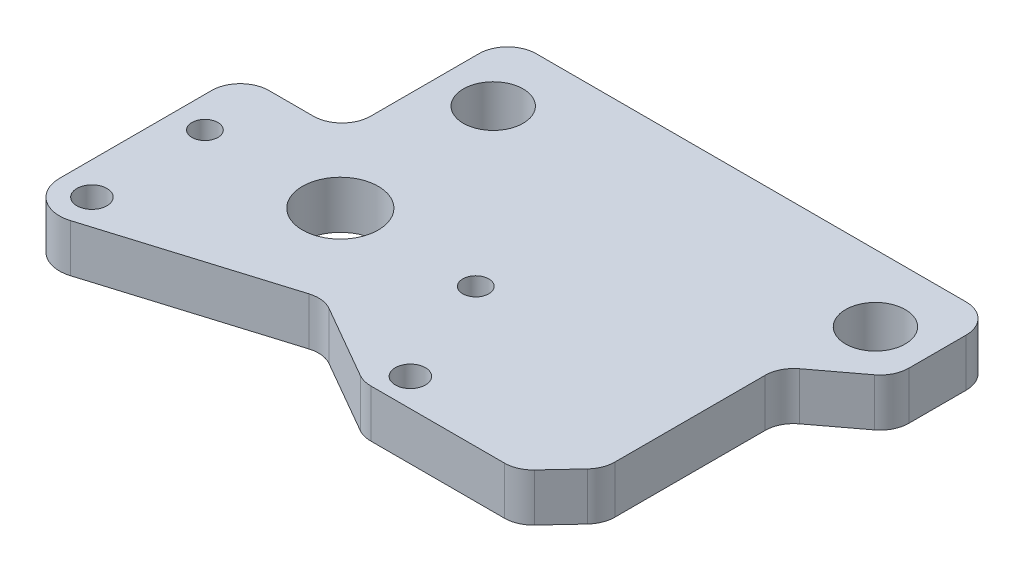
ISO-10303-21;
HEADER;
FILE_DESCRIPTION(('STEP AP214'),'2;1');
FILE_NAME('part.step','',(''),(''),'','','');
FILE_SCHEMA(('AUTOMOTIVE_DESIGN { 1 0 10303 214 1 1 1 1 }'));
ENDSEC;
DATA;
#1=APPLICATION_CONTEXT('core data for automotive mechanical design processes');
#2=APPLICATION_PROTOCOL_DEFINITION('international standard','automotive_design',2000,#1);
#3=PRODUCT_CONTEXT('',#1,'mechanical');
#4=PRODUCT('Part','Part','',(#3));
#5=PRODUCT_RELATED_PRODUCT_CATEGORY('part','',(#4));
#6=PRODUCT_DEFINITION_FORMATION('','',#4);
#7=PRODUCT_DEFINITION_CONTEXT('part definition',#1,'design');
#8=PRODUCT_DEFINITION('design','',#6,#7);
#9=PRODUCT_DEFINITION_SHAPE('','',#8);
#10=(LENGTH_UNIT() NAMED_UNIT(*) SI_UNIT(.MILLI.,.METRE.));
#11=(NAMED_UNIT(*) PLANE_ANGLE_UNIT() SI_UNIT($,.RADIAN.));
#12=(NAMED_UNIT(*) SI_UNIT($,.STERADIAN.) SOLID_ANGLE_UNIT());
#13=UNCERTAINTY_MEASURE_WITH_UNIT(LENGTH_MEASURE(1.E-05),#10,'distance_accuracy_value','');
#14=(GEOMETRIC_REPRESENTATION_CONTEXT(3) GLOBAL_UNCERTAINTY_ASSIGNED_CONTEXT((#13)) GLOBAL_UNIT_ASSIGNED_CONTEXT((#10,
#11,#12)) REPRESENTATION_CONTEXT('',''));
#15=CARTESIAN_POINT('',(0.,0.,0.));
#16=DIRECTION('',(0.,0.,1.));
#17=DIRECTION('',(1.,0.,0.));
#18=AXIS2_PLACEMENT_3D('',#15,#16,#17);
#19=CARTESIAN_POINT('',(4.00320661854568,-6.35,13.0969768672636));
#20=DIRECTION('',(-0.29230886403007,0.,-0.95632396603319));
#21=DIRECTION('',(-0.95632396603319,0.,0.29230886403007));
#22=AXIS2_PLACEMENT_3D('',#19,#20,#21);
#23=PLANE('',#22);
#24=DIRECTION('',(-0.95632396603319,0.,0.29230886403007));
#25=VECTOR('',#24,1.);
#26=CARTESIAN_POINT('',(4.00320661854568,0.,13.0969768672636));
#27=LINE('',#26,#25);
#28=CARTESIAN_POINT('',(7.76555921931062,0.,11.9469805753459));
#29=VERTEX_POINT('',#28);
#30=CARTESIAN_POINT('',(-16.5178103251182,0.,19.3694068853313));
#31=VERTEX_POINT('',#30);
#32=EDGE_CURVE('E258',#29,#31,#27,.T.);
#33=ORIENTED_EDGE('',*,*,#32,.T.);
#34=DIRECTION('',(0.,1.,0.));
#35=VECTOR('',#34,1.);
#36=CARTESIAN_POINT('',(-16.5178103251182,-6.35,19.3694068853313));
#37=LINE('',#36,#35);
#38=CARTESIAN_POINT('',(-16.5178103251182,-6.35,19.3694068853313));
#39=VERTEX_POINT('',#38);
#40=EDGE_CURVE('E11',#39,#31,#37,.T.);
#41=ORIENTED_EDGE('',*,*,#40,.F.);
#42=DIRECTION('',(-0.95632396603319,0.,0.29230886403007));
#43=VECTOR('',#42,1.);
#44=CARTESIAN_POINT('',(4.00320661854568,-6.35,13.0969768672636));
#45=LINE('',#44,#43);
#46=CARTESIAN_POINT('',(7.76555921931062,-6.35,11.9469805753459));
#47=VERTEX_POINT('',#46);
#48=EDGE_CURVE('E399',#47,#39,#45,.T.);
#49=ORIENTED_EDGE('',*,*,#48,.F.);
#50=DIRECTION('',(0.,1.,0.));
#51=VECTOR('',#50,1.);
#52=CARTESIAN_POINT('',(7.76555921931062,-6.35,11.9469805753459));
#53=LINE('',#52,#51);
#54=EDGE_CURVE('E47',#47,#29,#53,.T.);
#55=ORIENTED_EDGE('',*,*,#54,.T.);
#56=EDGE_LOOP('',(#33,#41,#49,#55));
#57=FACE_BOUND('',#56,.T.);
#58=ADVANCED_FACE('F43',(#57),#23,.F.);
#59=CARTESIAN_POINT('',(-17.78,-6.35,15.24));
#60=DIRECTION('',(0.,1.,0.));
#61=DIRECTION('',(0.,0.,1.));
#62=AXIS2_PLACEMENT_3D('',#59,#60,#61);
#63=CYLINDRICAL_SURFACE('',#62,4.318);
#64=CARTESIAN_POINT('',(-17.78,0.,15.24));
#65=DIRECTION('',(0.,1.,0.));
#66=DIRECTION('',(0.,0.,1.));
#67=AXIS2_PLACEMENT_3D('',#64,#65,#66);
#68=CIRCLE('',#67,4.318);
#69=CARTESIAN_POINT('',(-22.098,0.,15.24));
#70=VERTEX_POINT('',#69);
#71=EDGE_CURVE('E130',#31,#70,#68,.F.);
#72=ORIENTED_EDGE('',*,*,#71,.T.);
#73=DIRECTION('',(0.,1.,0.));
#74=VECTOR('',#73,1.);
#75=CARTESIAN_POINT('',(-22.098,-6.35,15.24));
#76=LINE('',#75,#74);
#77=CARTESIAN_POINT('',(-22.098,-6.35,15.24));
#78=VERTEX_POINT('',#77);
#79=EDGE_CURVE('E54',#78,#70,#76,.T.);
#80=ORIENTED_EDGE('',*,*,#79,.F.);
#81=CARTESIAN_POINT('',(-17.78,-6.35,15.24));
#82=DIRECTION('',(0.,1.,0.));
#83=DIRECTION('',(0.,0.,1.));
#84=AXIS2_PLACEMENT_3D('',#81,#82,#83);
#85=CIRCLE('',#84,4.318);
#86=EDGE_CURVE('E62',#39,#78,#85,.F.);
#87=ORIENTED_EDGE('',*,*,#86,.F.);
#88=ORIENTED_EDGE('',*,*,#40,.T.);
#89=EDGE_LOOP('',(#72,#80,#87,#88));
#90=FACE_BOUND('',#89,.T.);
#91=ADVANCED_FACE('F417',(#90),#63,.T.);
#92=CARTESIAN_POINT('',(-22.098,-6.35,0.));
#93=DIRECTION('',(1.,0.,0.));
#94=DIRECTION('',(0.,0.,-1.));
#95=AXIS2_PLACEMENT_3D('',#92,#93,#94);
#96=PLANE('',#95);
#97=DIRECTION('',(0.,0.,-1.));
#98=VECTOR('',#97,1.);
#99=CARTESIAN_POINT('',(-22.098,0.,0.));
#100=LINE('',#99,#98);
#101=CARTESIAN_POINT('',(-22.098,0.,-4.98750012199999));
#102=VERTEX_POINT('',#101);
#103=EDGE_CURVE('E211',#70,#102,#100,.T.);
#104=ORIENTED_EDGE('',*,*,#103,.T.);
#105=DIRECTION('',(0.,1.,0.));
#106=VECTOR('',#105,1.);
#107=CARTESIAN_POINT('',(-22.098,-6.35,-4.98750012199999));
#108=LINE('',#107,#106);
#109=CARTESIAN_POINT('',(-22.098,-6.35,-4.98750012199999));
#110=VERTEX_POINT('',#109);
#111=EDGE_CURVE('E209',#110,#102,#108,.T.);
#112=ORIENTED_EDGE('',*,*,#111,.F.);
#113=DIRECTION('',(0.,0.,-1.));
#114=VECTOR('',#113,1.);
#115=CARTESIAN_POINT('',(-22.098,-6.35,0.));
#116=LINE('',#115,#114);
#117=EDGE_CURVE('E199',#78,#110,#116,.T.);
#118=ORIENTED_EDGE('',*,*,#117,.F.);
#119=ORIENTED_EDGE('',*,*,#79,.T.);
#120=EDGE_LOOP('',(#104,#112,#118,#119));
#121=FACE_BOUND('',#120,.T.);
#122=ADVANCED_FACE('F210',(#121),#96,.F.);
#123=CARTESIAN_POINT('',(-18.288,-6.35,-4.98750012199999));
#124=DIRECTION('',(0.,1.,0.));
#125=DIRECTION('',(0.,0.,1.));
#126=AXIS2_PLACEMENT_3D('',#123,#124,#125);
#127=CYLINDRICAL_SURFACE('',#126,3.81);
#128=CARTESIAN_POINT('',(-18.288,0.,-4.98750012199999));
#129=DIRECTION('',(0.,1.,0.));
#130=DIRECTION('',(0.,0.,1.));
#131=AXIS2_PLACEMENT_3D('',#128,#129,#130);
#132=CIRCLE('',#131,3.81);
#133=CARTESIAN_POINT('',(-18.288,0.,-8.797500122));
#134=VERTEX_POINT('',#133);
#135=EDGE_CURVE('E327',#102,#134,#132,.F.);
#136=ORIENTED_EDGE('',*,*,#135,.T.);
#137=DIRECTION('',(0.,1.,0.));
#138=VECTOR('',#137,1.);
#139=CARTESIAN_POINT('',(-18.288,-6.35,-8.797500122));
#140=LINE('',#139,#138);
#141=CARTESIAN_POINT('',(-18.288,-6.35,-8.797500122));
#142=VERTEX_POINT('',#141);
#143=EDGE_CURVE('E215',#142,#134,#140,.T.);
#144=ORIENTED_EDGE('',*,*,#143,.F.);
#145=CARTESIAN_POINT('',(-18.288,-6.35,-4.98750012199999));
#146=DIRECTION('',(0.,1.,0.));
#147=DIRECTION('',(0.,0.,1.));
#148=AXIS2_PLACEMENT_3D('',#145,#146,#147);
#149=CIRCLE('',#148,3.81);
#150=EDGE_CURVE('E203',#110,#142,#149,.F.);
#151=ORIENTED_EDGE('',*,*,#150,.F.);
#152=ORIENTED_EDGE('',*,*,#111,.T.);
#153=EDGE_LOOP('',(#136,#144,#151,#152));
#154=FACE_BOUND('',#153,.T.);
#155=ADVANCED_FACE('F217',(#154),#127,.T.);
#156=CARTESIAN_POINT('',(0.,-6.35,-8.797500122));
#157=DIRECTION('',(0.,0.,1.));
#158=DIRECTION('',(1.,0.,0.));
#159=AXIS2_PLACEMENT_3D('',#156,#157,#158);
#160=PLANE('',#159);
#161=DIRECTION('',(1.,0.,0.));
#162=VECTOR('',#161,1.);
#163=CARTESIAN_POINT('',(0.,0.,-8.797500122));
#164=LINE('',#163,#162);
#165=CARTESIAN_POINT('',(-12.3825,0.,-8.797500122));
#166=VERTEX_POINT('',#165);
#167=EDGE_CURVE('E324',#134,#166,#164,.T.);
#168=ORIENTED_EDGE('',*,*,#167,.T.);
#169=DIRECTION('',(0.,1.,0.));
#170=VECTOR('',#169,1.);
#171=CARTESIAN_POINT('',(-12.3825,-6.35,-8.797500122));
#172=LINE('',#171,#170);
#173=CARTESIAN_POINT('',(-12.3825,-6.35,-8.797500122));
#174=VERTEX_POINT('',#173);
#175=EDGE_CURVE('E339',#174,#166,#172,.T.);
#176=ORIENTED_EDGE('',*,*,#175,.F.);
#177=DIRECTION('',(1.,0.,0.));
#178=VECTOR('',#177,1.);
#179=CARTESIAN_POINT('',(0.,-6.35,-8.797500122));
#180=LINE('',#179,#178);
#181=EDGE_CURVE('E221',#142,#174,#180,.T.);
#182=ORIENTED_EDGE('',*,*,#181,.F.);
#183=ORIENTED_EDGE('',*,*,#143,.T.);
#184=EDGE_LOOP('',(#168,#176,#182,#183));
#185=FACE_BOUND('',#184,.T.);
#186=ADVANCED_FACE('F479',(#185),#160,.F.);
#187=CARTESIAN_POINT('',(-12.3825,-6.35,-12.607500122));
#188=DIRECTION('',(0.,1.,0.));
#189=DIRECTION('',(0.,0.,1.));
#190=AXIS2_PLACEMENT_3D('',#187,#188,#189);
#191=CYLINDRICAL_SURFACE('',#190,3.81);
#192=CARTESIAN_POINT('',(-12.3825,0.,-12.607500122));
#193=DIRECTION('',(0.,1.,0.));
#194=DIRECTION('',(0.,0.,1.));
#195=AXIS2_PLACEMENT_3D('',#192,#193,#194);
#196=CIRCLE('',#195,3.81);
#197=CARTESIAN_POINT('',(-8.57250000000001,0.,-12.607500122));
#198=VERTEX_POINT('',#197);
#199=EDGE_CURVE('E320',#166,#198,#196,.T.);
#200=ORIENTED_EDGE('',*,*,#199,.T.);
#201=DIRECTION('',(0.,1.,0.));
#202=VECTOR('',#201,1.);
#203=CARTESIAN_POINT('',(-8.57250000000001,-6.35,-12.607500122));
#204=LINE('',#203,#202);
#205=CARTESIAN_POINT('',(-8.57250000000001,-6.35,-12.607500122));
#206=VERTEX_POINT('',#205);
#207=EDGE_CURVE('E343',#206,#198,#204,.T.);
#208=ORIENTED_EDGE('',*,*,#207,.F.);
#209=CARTESIAN_POINT('',(-12.3825,-6.35,-12.607500122));
#210=DIRECTION('',(0.,1.,0.));
#211=DIRECTION('',(0.,0.,1.));
#212=AXIS2_PLACEMENT_3D('',#209,#210,#211);
#213=CIRCLE('',#212,3.81);
#214=EDGE_CURVE('E224',#174,#206,#213,.T.);
#215=ORIENTED_EDGE('',*,*,#214,.F.);
#216=ORIENTED_EDGE('',*,*,#175,.T.);
#217=EDGE_LOOP('',(#200,#208,#215,#216));
#218=FACE_BOUND('',#217,.T.);
#219=ADVANCED_FACE('F482',(#218),#191,.F.);
#220=CARTESIAN_POINT('',(-8.57250000000001,-6.35,0.));
#221=DIRECTION('',(-1.,0.,0.));
#222=DIRECTION('',(0.,0.,1.));
#223=AXIS2_PLACEMENT_3D('',#220,#221,#222);
#224=PLANE('',#223);
#225=DIRECTION('',(0.,0.,1.));
#226=VECTOR('',#225,1.);
#227=CARTESIAN_POINT('',(-8.57250000000001,0.,0.));
#228=LINE('',#227,#226);
#229=CARTESIAN_POINT('',(-8.5725,0.,-26.9875));
#230=VERTEX_POINT('',#229);
#231=EDGE_CURVE('E316',#230,#198,#228,.T.);
#232=ORIENTED_EDGE('',*,*,#231,.F.);
#233=DIRECTION('',(0.,1.,0.));
#234=VECTOR('',#233,1.);
#235=CARTESIAN_POINT('',(-8.5725,-6.35,-26.9875));
#236=LINE('',#235,#234);
#237=CARTESIAN_POINT('',(-8.5725,-6.35,-26.9875));
#238=VERTEX_POINT('',#237);
#239=EDGE_CURVE('E346',#238,#230,#236,.T.);
#240=ORIENTED_EDGE('',*,*,#239,.F.);
#241=DIRECTION('',(0.,0.,1.));
#242=VECTOR('',#241,1.);
#243=CARTESIAN_POINT('',(-8.57250000000001,-6.35,0.));
#244=LINE('',#243,#242);
#245=EDGE_CURVE('E600',#238,#206,#244,.T.);
#246=ORIENTED_EDGE('',*,*,#245,.T.);
#247=ORIENTED_EDGE('',*,*,#207,.T.);
#248=EDGE_LOOP('',(#232,#240,#246,#247));
#249=FACE_BOUND('',#248,.T.);
#250=ADVANCED_FACE('F486',(#249),#224,.T.);
#251=CARTESIAN_POINT('',(-4.7625,-6.35,-26.9875));
#252=DIRECTION('',(0.,1.,0.));
#253=DIRECTION('',(0.,0.,1.));
#254=AXIS2_PLACEMENT_3D('',#251,#252,#253);
#255=CYLINDRICAL_SURFACE('',#254,3.81);
#256=CARTESIAN_POINT('',(-4.7625,0.,-26.9875));
#257=DIRECTION('',(0.,1.,0.));
#258=DIRECTION('',(0.,0.,1.));
#259=AXIS2_PLACEMENT_3D('',#256,#257,#258);
#260=CIRCLE('',#259,3.81);
#261=CARTESIAN_POINT('',(-4.7625,0.,-30.7975));
#262=VERTEX_POINT('',#261);
#263=EDGE_CURVE('E312',#230,#262,#260,.F.);
#264=ORIENTED_EDGE('',*,*,#263,.T.);
#265=DIRECTION('',(0.,1.,0.));
#266=VECTOR('',#265,1.);
#267=CARTESIAN_POINT('',(-4.7625,-6.35,-30.7975));
#268=LINE('',#267,#266);
#269=CARTESIAN_POINT('',(-4.7625,-6.35,-30.7975));
#270=VERTEX_POINT('',#269);
#271=EDGE_CURVE('E349',#270,#262,#268,.T.);
#272=ORIENTED_EDGE('',*,*,#271,.F.);
#273=CARTESIAN_POINT('',(-4.7625,-6.35,-26.9875));
#274=DIRECTION('',(0.,1.,0.));
#275=DIRECTION('',(0.,0.,1.));
#276=AXIS2_PLACEMENT_3D('',#273,#274,#275);
#277=CIRCLE('',#276,3.81);
#278=EDGE_CURVE('E606',#238,#270,#277,.F.);
#279=ORIENTED_EDGE('',*,*,#278,.F.);
#280=ORIENTED_EDGE('',*,*,#239,.T.);
#281=EDGE_LOOP('',(#264,#272,#279,#280));
#282=FACE_BOUND('',#281,.T.);
#283=ADVANCED_FACE('F490',(#282),#255,.T.);
#284=CARTESIAN_POINT('',(0.,-6.35,-30.7975));
#285=DIRECTION('',(0.,0.,-1.));
#286=DIRECTION('',(-1.,0.,0.));
#287=AXIS2_PLACEMENT_3D('',#284,#285,#286);
#288=PLANE('',#287);
#289=DIRECTION('',(-1.,0.,0.));
#290=VECTOR('',#289,1.);
#291=CARTESIAN_POINT('',(0.,0.,-30.7975));
#292=LINE('',#291,#290);
#293=CARTESIAN_POINT('',(52.3875,0.,-30.7975));
#294=VERTEX_POINT('',#293);
#295=EDGE_CURVE('E308',#294,#262,#292,.T.);
#296=ORIENTED_EDGE('',*,*,#295,.F.);
#297=DIRECTION('',(0.,1.,0.));
#298=VECTOR('',#297,1.);
#299=CARTESIAN_POINT('',(52.3875,-6.35,-30.7975));
#300=LINE('',#299,#298);
#301=CARTESIAN_POINT('',(52.3875,-6.35,-30.7975));
#302=VERTEX_POINT('',#301);
#303=EDGE_CURVE('E352',#302,#294,#300,.T.);
#304=ORIENTED_EDGE('',*,*,#303,.F.);
#305=DIRECTION('',(-1.,0.,0.));
#306=VECTOR('',#305,1.);
#307=CARTESIAN_POINT('',(0.,-6.35,-30.7975));
#308=LINE('',#307,#306);
#309=EDGE_CURVE('E593',#302,#270,#308,.T.);
#310=ORIENTED_EDGE('',*,*,#309,.T.);
#311=ORIENTED_EDGE('',*,*,#271,.T.);
#312=EDGE_LOOP('',(#296,#304,#310,#311));
#313=FACE_BOUND('',#312,.T.);
#314=ADVANCED_FACE('F494',(#313),#288,.T.);
#315=CARTESIAN_POINT('',(52.3875,-6.35,-26.9875));
#316=DIRECTION('',(0.,1.,0.));
#317=DIRECTION('',(0.,0.,1.));
#318=AXIS2_PLACEMENT_3D('',#315,#316,#317);
#319=CYLINDRICAL_SURFACE('',#318,3.81);
#320=CARTESIAN_POINT('',(52.3875,0.,-26.9875));
#321=DIRECTION('',(0.,1.,0.));
#322=DIRECTION('',(0.,0.,1.));
#323=AXIS2_PLACEMENT_3D('',#320,#321,#322);
#324=CIRCLE('',#323,3.81);
#325=CARTESIAN_POINT('',(56.1975,0.,-26.9875));
#326=VERTEX_POINT('',#325);
#327=EDGE_CURVE('E304',#294,#326,#324,.F.);
#328=ORIENTED_EDGE('',*,*,#327,.T.);
#329=DIRECTION('',(0.,1.,0.));
#330=VECTOR('',#329,1.);
#331=CARTESIAN_POINT('',(56.1975,-6.35,-26.9875));
#332=LINE('',#331,#330);
#333=CARTESIAN_POINT('',(56.1975,-6.35,-26.9875));
#334=VERTEX_POINT('',#333);
#335=EDGE_CURVE('E355',#334,#326,#332,.T.);
#336=ORIENTED_EDGE('',*,*,#335,.F.);
#337=CARTESIAN_POINT('',(52.3875,-6.35,-26.9875));
#338=DIRECTION('',(0.,1.,0.));
#339=DIRECTION('',(0.,0.,1.));
#340=AXIS2_PLACEMENT_3D('',#337,#338,#339);
#341=CIRCLE('',#340,3.81);
#342=EDGE_CURVE('E613',#302,#334,#341,.F.);
#343=ORIENTED_EDGE('',*,*,#342,.F.);
#344=ORIENTED_EDGE('',*,*,#303,.T.);
#345=EDGE_LOOP('',(#328,#336,#343,#344));
#346=FACE_BOUND('',#345,.T.);
#347=ADVANCED_FACE('F498',(#346),#319,.T.);
#348=CARTESIAN_POINT('',(56.1975,-6.35,1.02276151248003E-13));
#349=DIRECTION('',(1.,0.,0.));
#350=DIRECTION('',(0.,0.,-1.));
#351=AXIS2_PLACEMENT_3D('',#348,#349,#350);
#352=PLANE('',#351);
#353=DIRECTION('',(0.,0.,-1.));
#354=VECTOR('',#353,1.);
#355=CARTESIAN_POINT('',(56.1975,0.,1.02276151248003E-13));
#356=LINE('',#355,#354);
#357=CARTESIAN_POINT('',(56.1975,0.,-19.3620959266836));
#358=VERTEX_POINT('',#357);
#359=EDGE_CURVE('E300',#358,#326,#356,.T.);
#360=ORIENTED_EDGE('',*,*,#359,.F.);
#361=DIRECTION('',(0.,1.,0.));
#362=VECTOR('',#361,1.);
#363=CARTESIAN_POINT('',(56.1975,-6.35,-19.3620959266836));
#364=LINE('',#363,#362);
#365=CARTESIAN_POINT('',(56.1975,-6.35,-19.3620959266836));
#366=VERTEX_POINT('',#365);
#367=EDGE_CURVE('E358',#366,#358,#364,.T.);
#368=ORIENTED_EDGE('',*,*,#367,.F.);
#369=DIRECTION('',(0.,0.,-1.));
#370=VECTOR('',#369,1.);
#371=CARTESIAN_POINT('',(56.1975,-6.35,1.02276151248003E-13));
#372=LINE('',#371,#370);
#373=EDGE_CURVE('E586',#366,#334,#372,.T.);
#374=ORIENTED_EDGE('',*,*,#373,.T.);
#375=ORIENTED_EDGE('',*,*,#335,.T.);
#376=EDGE_LOOP('',(#360,#368,#374,#375));
#377=FACE_BOUND('',#376,.T.);
#378=ADVANCED_FACE('F502',(#377),#352,.T.);
#379=CARTESIAN_POINT('',(52.3875,-6.35,-19.3620959266836));
#380=DIRECTION('',(0.,1.,0.));
#381=DIRECTION('',(0.,0.,1.));
#382=AXIS2_PLACEMENT_3D('',#379,#380,#381);
#383=CYLINDRICAL_SURFACE('',#382,3.81);
#384=CARTESIAN_POINT('',(52.3875,0.,-19.3620959266836));
#385=DIRECTION('',(0.,1.,0.));
#386=DIRECTION('',(0.,0.,1.));
#387=AXIS2_PLACEMENT_3D('',#384,#385,#386);
#388=CIRCLE('',#387,3.81);
#389=CARTESIAN_POINT('',(54.6804152382093,0.,-16.3192946334034));
#390=VERTEX_POINT('',#389);
#391=EDGE_CURVE('E296',#358,#390,#388,.F.);
#392=ORIENTED_EDGE('',*,*,#391,.T.);
#393=DIRECTION('',(0.,1.,0.));
#394=VECTOR('',#393,1.);
#395=CARTESIAN_POINT('',(54.6804152382093,-6.35,-16.3192946334034));
#396=LINE('',#395,#394);
#397=CARTESIAN_POINT('',(54.6804152382093,-6.35,-16.3192946334034));
#398=VERTEX_POINT('',#397);
#399=EDGE_CURVE('E361',#398,#390,#396,.T.);
#400=ORIENTED_EDGE('',*,*,#399,.F.);
#401=CARTESIAN_POINT('',(52.3875,-6.35,-19.3620959266836));
#402=DIRECTION('',(0.,1.,0.));
#403=DIRECTION('',(0.,0.,1.));
#404=AXIS2_PLACEMENT_3D('',#401,#402,#403);
#405=CIRCLE('',#404,3.81);
#406=EDGE_CURVE('E618',#366,#398,#405,.F.);
#407=ORIENTED_EDGE('',*,*,#406,.F.);
#408=ORIENTED_EDGE('',*,*,#367,.T.);
#409=EDGE_LOOP('',(#392,#400,#407,#408));
#410=FACE_BOUND('',#409,.T.);
#411=ADVANCED_FACE('F506',(#410),#383,.T.);
#412=CARTESIAN_POINT('',(11.9606686655756,-6.35,15.8723434157696));
#413=DIRECTION('',(0.601815023152047,0.,0.798635510047294));
#414=DIRECTION('',(0.798635510047294,0.,-0.601815023152047));
#415=AXIS2_PLACEMENT_3D('',#412,#413,#414);
#416=PLANE('',#415);
#417=DIRECTION('',(0.798635510047294,0.,-0.601815023152047));
#418=VECTOR('',#417,1.);
#419=CARTESIAN_POINT('',(11.9606686655756,0.,15.8723434157696));
#420=LINE('',#419,#418);
#421=CARTESIAN_POINT('',(48.9855664772033,0.,-12.0279182848244));
#422=VERTEX_POINT('',#421);
#423=EDGE_CURVE('E292',#422,#390,#420,.T.);
#424=ORIENTED_EDGE('',*,*,#423,.F.);
#425=DIRECTION('',(0.,1.,0.));
#426=VECTOR('',#425,1.);
#427=CARTESIAN_POINT('',(48.9855664772033,-6.35,-12.0279182848244));
#428=LINE('',#427,#426);
#429=CARTESIAN_POINT('',(48.9855664772033,-6.35,-12.0279182848244));
#430=VERTEX_POINT('',#429);
#431=EDGE_CURVE('E364',#430,#422,#428,.T.);
#432=ORIENTED_EDGE('',*,*,#431,.F.);
#433=DIRECTION('',(0.798635510047294,0.,-0.601815023152047));
#434=VECTOR('',#433,1.);
#435=CARTESIAN_POINT('',(11.9606686655756,-6.35,15.8723434157696));
#436=LINE('',#435,#434);
#437=EDGE_CURVE('E621',#430,#398,#436,.T.);
#438=ORIENTED_EDGE('',*,*,#437,.T.);
#439=ORIENTED_EDGE('',*,*,#399,.T.);
#440=EDGE_LOOP('',(#424,#432,#438,#439));
#441=FACE_BOUND('',#440,.T.);
#442=ADVANCED_FACE('F510',(#441),#416,.T.);
#443=CARTESIAN_POINT('',(51.2784817154126,-6.35,-8.98511699154425));
#444=DIRECTION('',(0.,1.,0.));
#445=DIRECTION('',(0.,0.,1.));
#446=AXIS2_PLACEMENT_3D('',#443,#444,#445);
#447=CYLINDRICAL_SURFACE('',#446,3.80999999999999);
#448=CARTESIAN_POINT('',(51.2784817154126,0.,-8.98511699154425));
#449=DIRECTION('',(0.,1.,0.));
#450=DIRECTION('',(0.,0.,1.));
#451=AXIS2_PLACEMENT_3D('',#448,#449,#450);
#452=CIRCLE('',#451,3.80999999999999);
#453=CARTESIAN_POINT('',(47.4684817154126,0.,-8.98511699154425));
#454=VERTEX_POINT('',#453);
#455=EDGE_CURVE('E288',#454,#422,#452,.F.);
#456=ORIENTED_EDGE('',*,*,#455,.F.);
#457=DIRECTION('',(0.,1.,0.));
#458=VECTOR('',#457,1.);
#459=CARTESIAN_POINT('',(47.4684817154126,-6.35,-8.98511699154425));
#460=LINE('',#459,#458);
#461=CARTESIAN_POINT('',(47.4684817154126,-6.35,-8.98511699154425));
#462=VERTEX_POINT('',#461);
#463=EDGE_CURVE('E367',#462,#454,#460,.T.);
#464=ORIENTED_EDGE('',*,*,#463,.F.);
#465=CARTESIAN_POINT('',(51.2784817154126,-6.35,-8.98511699154425));
#466=DIRECTION('',(0.,1.,0.));
#467=DIRECTION('',(0.,0.,1.));
#468=AXIS2_PLACEMENT_3D('',#465,#466,#467);
#469=CIRCLE('',#468,3.80999999999999);
#470=EDGE_CURVE('E575',#462,#430,#469,.F.);
#471=ORIENTED_EDGE('',*,*,#470,.T.);
#472=ORIENTED_EDGE('',*,*,#431,.T.);
#473=EDGE_LOOP('',(#456,#464,#471,#472));
#474=FACE_BOUND('',#473,.T.);
#475=ADVANCED_FACE('F514',(#474),#447,.F.);
#476=CARTESIAN_POINT('',(47.4684817154126,-6.35,0.));
#477=DIRECTION('',(-1.,0.,0.));
#478=DIRECTION('',(0.,0.,1.));
#479=AXIS2_PLACEMENT_3D('',#476,#477,#478);
#480=PLANE('',#479);
#481=DIRECTION('',(0.,0.,1.));
#482=VECTOR('',#481,1.);
#483=CARTESIAN_POINT('',(47.4684817154126,0.,0.));
#484=LINE('',#483,#482);
#485=CARTESIAN_POINT('',(47.4684817154126,0.,10.9806107725939));
#486=VERTEX_POINT('',#485);
#487=EDGE_CURVE('E285',#454,#486,#484,.T.);
#488=ORIENTED_EDGE('',*,*,#487,.T.);
#489=DIRECTION('',(0.,1.,0.));
#490=VECTOR('',#489,1.);
#491=CARTESIAN_POINT('',(47.4684817154126,-6.35,10.9806107725939));
#492=LINE('',#491,#490);
#493=CARTESIAN_POINT('',(47.4684817154126,-6.35,10.9806107725939));
#494=VERTEX_POINT('',#493);
#495=EDGE_CURVE('E370',#494,#486,#492,.T.);
#496=ORIENTED_EDGE('',*,*,#495,.F.);
#497=DIRECTION('',(0.,0.,1.));
#498=VECTOR('',#497,1.);
#499=CARTESIAN_POINT('',(47.4684817154126,-6.35,0.));
#500=LINE('',#499,#498);
#501=EDGE_CURVE('E570',#462,#494,#500,.T.);
#502=ORIENTED_EDGE('',*,*,#501,.F.);
#503=ORIENTED_EDGE('',*,*,#463,.T.);
#504=EDGE_LOOP('',(#488,#496,#502,#503));
#505=FACE_BOUND('',#504,.T.);
#506=ADVANCED_FACE('F518',(#505),#480,.F.);
#507=CARTESIAN_POINT('',(43.6584817154126,-6.35,10.9806107725939));
#508=DIRECTION('',(0.,1.,0.));
#509=DIRECTION('',(0.,0.,1.));
#510=AXIS2_PLACEMENT_3D('',#507,#508,#509);
#511=CYLINDRICAL_SURFACE('',#510,3.81);
#512=CARTESIAN_POINT('',(43.6584817154126,0.,10.9806107725939));
#513=DIRECTION('',(0.,1.,0.));
#514=DIRECTION('',(0.,0.,1.));
#515=AXIS2_PLACEMENT_3D('',#512,#513,#514);
#516=CIRCLE('',#515,3.81);
#517=CARTESIAN_POINT('',(46.4449393185816,0.,13.579024524432));
#518=VERTEX_POINT('',#517);
#519=EDGE_CURVE('E282',#486,#518,#516,.F.);
#520=ORIENTED_EDGE('',*,*,#519,.T.);
#521=DIRECTION('',(0.,1.,0.));
#522=VECTOR('',#521,1.);
#523=CARTESIAN_POINT('',(46.4449393185816,-6.35,13.579024524432));
#524=LINE('',#523,#522);
#525=CARTESIAN_POINT('',(46.4449393185816,-6.35,13.579024524432));
#526=VERTEX_POINT('',#525);
#527=EDGE_CURVE('E374',#526,#518,#524,.T.);
#528=ORIENTED_EDGE('',*,*,#527,.F.);
#529=CARTESIAN_POINT('',(43.6584817154126,-6.35,10.9806107725939));
#530=DIRECTION('',(0.,1.,0.));
#531=DIRECTION('',(0.,0.,1.));
#532=AXIS2_PLACEMENT_3D('',#529,#530,#531);
#533=CIRCLE('',#532,3.81);
#534=EDGE_CURVE('E567',#494,#526,#533,.F.);
#535=ORIENTED_EDGE('',*,*,#534,.F.);
#536=ORIENTED_EDGE('',*,*,#495,.T.);
#537=EDGE_LOOP('',(#520,#528,#535,#536));
#538=FACE_BOUND('',#537,.T.);
#539=ADVANCED_FACE('F522',(#538),#511,.T.);
#540=CARTESIAN_POINT('',(31.6153606059378,-6.35,29.4818007187193));
#541=DIRECTION('',(-0.73135370161917,0.,-0.681998360062499));
#542=DIRECTION('',(-0.681998360062499,0.,0.73135370161917));
#543=AXIS2_PLACEMENT_3D('',#540,#541,#542);
#544=PLANE('',#543);
#545=DIRECTION('',(-0.681998360062499,0.,0.73135370161917));
#546=VECTOR('',#545,1.);
#547=CARTESIAN_POINT('',(31.6153606059378,0.,29.4818007187193));
#548=LINE('',#547,#546);
#549=CARTESIAN_POINT('',(43.0441600965525,0.,17.2259137518381));
#550=VERTEX_POINT('',#549);
#551=EDGE_CURVE('E279',#518,#550,#548,.T.);
#552=ORIENTED_EDGE('',*,*,#551,.T.);
#553=DIRECTION('',(0.,1.,0.));
#554=VECTOR('',#553,1.);
#555=CARTESIAN_POINT('',(43.0441600965525,-6.35,17.2259137518381));
#556=LINE('',#555,#554);
#557=CARTESIAN_POINT('',(43.0441600965525,-6.35,17.2259137518381));
#558=VERTEX_POINT('',#557);
#559=EDGE_CURVE('E378',#558,#550,#556,.T.);
#560=ORIENTED_EDGE('',*,*,#559,.F.);
#561=DIRECTION('',(-0.681998360062499,0.,0.73135370161917));
#562=VECTOR('',#561,1.);
#563=CARTESIAN_POINT('',(31.6153606059378,-6.35,29.4818007187193));
#564=LINE('',#563,#562);
#565=EDGE_CURVE('E565',#526,#558,#564,.T.);
#566=ORIENTED_EDGE('',*,*,#565,.F.);
#567=ORIENTED_EDGE('',*,*,#527,.T.);
#568=EDGE_LOOP('',(#552,#560,#566,#567));
#569=FACE_BOUND('',#568,.T.);
#570=ADVANCED_FACE('F526',(#569),#544,.F.);
#571=CARTESIAN_POINT('',(40.2577024933834,-6.35,14.6275));
#572=DIRECTION('',(0.,1.,0.));
#573=DIRECTION('',(0.,0.,1.));
#574=AXIS2_PLACEMENT_3D('',#571,#572,#573);
#575=CYLINDRICAL_SURFACE('',#574,3.81);
#576=CARTESIAN_POINT('',(40.2577024933834,0.,14.6275));
#577=DIRECTION('',(0.,1.,0.));
#578=DIRECTION('',(0.,0.,1.));
#579=AXIS2_PLACEMENT_3D('',#576,#577,#578);
#580=CIRCLE('',#579,3.81);
#581=CARTESIAN_POINT('',(40.2577024933834,0.,18.4375));
#582=VERTEX_POINT('',#581);
#583=EDGE_CURVE('E276',#550,#582,#580,.F.);
#584=ORIENTED_EDGE('',*,*,#583,.T.);
#585=DIRECTION('',(0.,1.,0.));
#586=VECTOR('',#585,1.);
#587=CARTESIAN_POINT('',(40.2577024933834,-6.35,18.4375));
#588=LINE('',#587,#586);
#589=CARTESIAN_POINT('',(40.2577024933834,-6.35,18.4375));
#590=VERTEX_POINT('',#589);
#591=EDGE_CURVE('E382',#590,#582,#588,.T.);
#592=ORIENTED_EDGE('',*,*,#591,.F.);
#593=CARTESIAN_POINT('',(40.2577024933834,-6.35,14.6275));
#594=DIRECTION('',(0.,1.,0.));
#595=DIRECTION('',(0.,0.,1.));
#596=AXIS2_PLACEMENT_3D('',#593,#594,#595);
#597=CIRCLE('',#596,3.81);
#598=EDGE_CURVE('E558',#558,#590,#597,.F.);
#599=ORIENTED_EDGE('',*,*,#598,.F.);
#600=ORIENTED_EDGE('',*,*,#559,.T.);
#601=EDGE_LOOP('',(#584,#592,#599,#600));
#602=FACE_BOUND('',#601,.T.);
#603=ADVANCED_FACE('F530',(#602),#575,.T.);
#604=CARTESIAN_POINT('',(0.,-6.35,18.4375));
#605=DIRECTION('',(0.,0.,-1.));
#606=DIRECTION('',(-1.,0.,0.));
#607=AXIS2_PLACEMENT_3D('',#604,#605,#606);
#608=PLANE('',#607);
#609=DIRECTION('',(-1.,0.,0.));
#610=VECTOR('',#609,1.);
#611=CARTESIAN_POINT('',(0.,0.,18.4375));
#612=LINE('',#611,#610);
#613=CARTESIAN_POINT('',(22.4839005830095,0.,18.4375));
#614=VERTEX_POINT('',#613);
#615=EDGE_CURVE('E273',#582,#614,#612,.T.);
#616=ORIENTED_EDGE('',*,*,#615,.T.);
#617=DIRECTION('',(0.,1.,0.));
#618=VECTOR('',#617,1.);
#619=CARTESIAN_POINT('',(22.4839005830095,-6.35,18.4375));
#620=LINE('',#619,#618);
#621=CARTESIAN_POINT('',(22.4839005830095,-6.35,18.4375));
#622=VERTEX_POINT('',#621);
#623=EDGE_CURVE('E386',#622,#614,#620,.T.);
#624=ORIENTED_EDGE('',*,*,#623,.F.);
#625=DIRECTION('',(-1.,0.,0.));
#626=VECTOR('',#625,1.);
#627=CARTESIAN_POINT('',(0.,-6.35,18.4375));
#628=LINE('',#627,#626);
#629=EDGE_CURVE('E555',#590,#622,#628,.T.);
#630=ORIENTED_EDGE('',*,*,#629,.F.);
#631=ORIENTED_EDGE('',*,*,#591,.T.);
#632=EDGE_LOOP('',(#616,#624,#630,#631));
#633=FACE_BOUND('',#632,.T.);
#634=ADVANCED_FACE('F534',(#633),#608,.F.);
#635=CARTESIAN_POINT('',(22.4839005830095,-6.35,14.6275));
#636=DIRECTION('',(0.,1.,0.));
#637=DIRECTION('',(0.,0.,1.));
#638=AXIS2_PLACEMENT_3D('',#635,#636,#637);
#639=CYLINDRICAL_SURFACE('',#638,3.81);
#640=CARTESIAN_POINT('',(22.4839005830095,0.,14.6275));
#641=DIRECTION('',(0.,1.,0.));
#642=DIRECTION('',(0.,0.,1.));
#643=AXIS2_PLACEMENT_3D('',#640,#641,#642);
#644=CIRCLE('',#643,3.81);
#645=CARTESIAN_POINT('',(20.5836799249687,0.,17.9298115314511));
#646=VERTEX_POINT('',#645);
#647=EDGE_CURVE('E270',#614,#646,#644,.F.);
#648=ORIENTED_EDGE('',*,*,#647,.T.);
#649=DIRECTION('',(0.,1.,0.));
#650=VECTOR('',#649,1.);
#651=CARTESIAN_POINT('',(20.5836799249687,-6.35,17.9298115314511));
#652=LINE('',#651,#650);
#653=CARTESIAN_POINT('',(20.5836799249687,-6.35,17.9298115314511));
#654=VERTEX_POINT('',#653);
#655=EDGE_CURVE('E390',#654,#646,#652,.T.);
#656=ORIENTED_EDGE('',*,*,#655,.F.);
#657=CARTESIAN_POINT('',(22.4839005830095,-6.35,14.6275));
#658=DIRECTION('',(0.,1.,0.));
#659=DIRECTION('',(0.,0.,1.));
#660=AXIS2_PLACEMENT_3D('',#657,#658,#659);
#661=CIRCLE('',#660,3.81);
#662=EDGE_CURVE('E553',#622,#654,#661,.F.);
#663=ORIENTED_EDGE('',*,*,#662,.F.);
#664=ORIENTED_EDGE('',*,*,#623,.T.);
#665=EDGE_LOOP('',(#648,#656,#663,#664));
#666=FACE_BOUND('',#665,.T.);
#667=ADVANCED_FACE('F538',(#666),#639,.T.);
#668=CARTESIAN_POINT('',(-2.63069175478496,-6.35,4.57176574770906));
#669=DIRECTION('',(0.498745579538251,0.,-0.866748433451745));
#670=DIRECTION('',(-0.866748433451745,0.,-0.498745579538251));
#671=AXIS2_PLACEMENT_3D('',#668,#669,#670);
#672=PLANE('',#671);
#673=DIRECTION('',(-0.866748433451745,0.,-0.498745579538251));
#674=VECTOR('',#673,1.);
#675=CARTESIAN_POINT('',(-2.63069175478496,0.,4.57176574770906));
#676=LINE('',#675,#674);
#677=CARTESIAN_POINT('',(10.779476649306,0.,12.2882633544812));
#678=VERTEX_POINT('',#677);
#679=EDGE_CURVE('E266',#646,#678,#676,.T.);
#680=ORIENTED_EDGE('',*,*,#679,.T.);
#681=DIRECTION('',(0.,1.,0.));
#682=VECTOR('',#681,1.);
#683=CARTESIAN_POINT('',(10.779476649306,-6.35,12.2882633544812));
#684=LINE('',#683,#682);
#685=CARTESIAN_POINT('',(10.779476649306,-6.35,12.2882633544812));
#686=VERTEX_POINT('',#685);
#687=EDGE_CURVE('E393',#686,#678,#684,.T.);
#688=ORIENTED_EDGE('',*,*,#687,.F.);
#689=DIRECTION('',(-0.866748433451745,0.,-0.498745579538251));
#690=VECTOR('',#689,1.);
#691=CARTESIAN_POINT('',(-2.63069175478496,-6.35,4.57176574770906));
#692=LINE('',#691,#690);
#693=EDGE_CURVE('E638',#654,#686,#692,.T.);
#694=ORIENTED_EDGE('',*,*,#693,.F.);
#695=ORIENTED_EDGE('',*,*,#655,.T.);
#696=EDGE_LOOP('',(#680,#688,#694,#695));
#697=FACE_BOUND('',#696,.T.);
#698=ADVANCED_FACE('F427',(#697),#672,.F.);
#699=CARTESIAN_POINT('',(-17.78,-6.35,15.24));
#700=DIRECTION('',(0.,1.,0.));
#701=DIRECTION('',(0.,0.,1.));
#702=AXIS2_PLACEMENT_3D('',#699,#700,#701);
#703=CYLINDRICAL_SURFACE('',#702,2.);
#704=CARTESIAN_POINT('',(-17.78,-6.35,15.24));
#705=DIRECTION('',(0.,1.,0.));
#706=DIRECTION('',(0.,0.,1.));
#707=AXIS2_PLACEMENT_3D('',#704,#705,#706);
#708=CIRCLE('',#707,2.);
#709=CARTESIAN_POINT('',(-17.78,-6.35,17.24));
#710=VERTEX_POINT('',#709);
#711=EDGE_CURVE('E646',#710,#710,#708,.T.);
#712=ORIENTED_EDGE('',*,*,#711,.F.);
#713=EDGE_LOOP('',(#712));
#714=FACE_BOUND('',#713,.T.);
#715=CARTESIAN_POINT('',(-17.78,0.,15.24));
#716=DIRECTION('',(0.,1.,0.));
#717=DIRECTION('',(0.,0.,1.));
#718=AXIS2_PLACEMENT_3D('',#715,#716,#717);
#719=CIRCLE('',#718,2.);
#720=CARTESIAN_POINT('',(-17.78,0.,17.24));
#721=VERTEX_POINT('',#720);
#722=EDGE_CURVE('E254',#721,#721,#719,.T.);
#723=ORIENTED_EDGE('',*,*,#722,.T.);
#724=EDGE_LOOP('',(#723));
#725=FACE_BOUND('',#724,.T.);
#726=ADVANCED_FACE('F423',(#714,#725),#703,.F.);
#727=CARTESIAN_POINT('',(24.0125212267774,-6.35,14.7035990265501));
#728=DIRECTION('',(0.,1.,0.));
#729=DIRECTION('',(0.,0.,1.));
#730=AXIS2_PLACEMENT_3D('',#727,#728,#729);
#731=CYLINDRICAL_SURFACE('',#730,2.00000000000001);
#732=CARTESIAN_POINT('',(24.0125212267774,-6.35,14.7035990265501));
#733=DIRECTION('',(0.,1.,0.));
#734=DIRECTION('',(0.,0.,1.));
#735=AXIS2_PLACEMENT_3D('',#732,#733,#734);
#736=CIRCLE('',#735,2.00000000000001);
#737=CARTESIAN_POINT('',(24.0125212267774,-6.35,16.7035990265501));
#738=VERTEX_POINT('',#737);
#739=EDGE_CURVE('E650',#738,#738,#736,.T.);
#740=ORIENTED_EDGE('',*,*,#739,.F.);
#741=EDGE_LOOP('',(#740));
#742=FACE_BOUND('',#741,.T.);
#743=CARTESIAN_POINT('',(24.0125212267774,0.,14.7035990265501));
#744=DIRECTION('',(0.,1.,0.));
#745=DIRECTION('',(0.,0.,1.));
#746=AXIS2_PLACEMENT_3D('',#743,#744,#745);
#747=CIRCLE('',#746,2.00000000000001);
#748=CARTESIAN_POINT('',(24.0125212267774,0.,16.7035990265501));
#749=VERTEX_POINT('',#748);
#750=EDGE_CURVE('E250',#749,#749,#747,.T.);
#751=ORIENTED_EDGE('',*,*,#750,.T.);
#752=EDGE_LOOP('',(#751));
#753=FACE_BOUND('',#752,.T.);
#754=ADVANCED_FACE('F426',(#742,#753),#731,.F.);
#755=CARTESIAN_POINT('',(49.2125,-6.35,-21.9075));
#756=DIRECTION('',(0.,1.,0.));
#757=DIRECTION('',(0.,0.,1.));
#758=AXIS2_PLACEMENT_3D('',#755,#756,#757);
#759=CYLINDRICAL_SURFACE('',#758,3.96874999999998);
#760=CARTESIAN_POINT('',(49.2125,-6.35,-21.9075));
#761=DIRECTION('',(0.,1.,0.));
#762=DIRECTION('',(0.,0.,1.));
#763=AXIS2_PLACEMENT_3D('',#760,#761,#762);
#764=CIRCLE('',#763,3.96874999999998);
#765=CARTESIAN_POINT('',(49.2125,-6.35,-17.93875));
#766=VERTEX_POINT('',#765);
#767=EDGE_CURVE('E654',#766,#766,#764,.T.);
#768=ORIENTED_EDGE('',*,*,#767,.F.);
#769=EDGE_LOOP('',(#768));
#770=FACE_BOUND('',#769,.T.);
#771=CARTESIAN_POINT('',(49.2125,0.,-21.9075));
#772=DIRECTION('',(0.,1.,0.));
#773=DIRECTION('',(0.,0.,1.));
#774=AXIS2_PLACEMENT_3D('',#771,#772,#773);
#775=CIRCLE('',#774,3.96874999999998);
#776=CARTESIAN_POINT('',(49.2125,0.,-17.93875));
#777=VERTEX_POINT('',#776);
#778=EDGE_CURVE('E246',#777,#777,#775,.T.);
#779=ORIENTED_EDGE('',*,*,#778,.T.);
#780=EDGE_LOOP('',(#779));
#781=FACE_BOUND('',#780,.T.);
#782=ADVANCED_FACE('F431',(#770,#781),#759,.F.);
#783=CARTESIAN_POINT('',(-1.5875,-6.35,-21.9075));
#784=DIRECTION('',(0.,1.,0.));
#785=DIRECTION('',(0.,0.,1.));
#786=AXIS2_PLACEMENT_3D('',#783,#784,#785);
#787=CYLINDRICAL_SURFACE('',#786,3.96875);
#788=CARTESIAN_POINT('',(-1.5875,-6.35,-21.9075));
#789=DIRECTION('',(0.,1.,0.));
#790=DIRECTION('',(0.,0.,1.));
#791=AXIS2_PLACEMENT_3D('',#788,#789,#790);
#792=CIRCLE('',#791,3.96875);
#793=CARTESIAN_POINT('',(-1.5875,-6.35,-17.93875));
#794=VERTEX_POINT('',#793);
#795=EDGE_CURVE('E658',#794,#794,#792,.T.);
#796=ORIENTED_EDGE('',*,*,#795,.F.);
#797=EDGE_LOOP('',(#796));
#798=FACE_BOUND('',#797,.T.);
#799=CARTESIAN_POINT('',(-1.5875,0.,-21.9075));
#800=DIRECTION('',(0.,1.,0.));
#801=DIRECTION('',(0.,0.,1.));
#802=AXIS2_PLACEMENT_3D('',#799,#800,#801);
#803=CIRCLE('',#802,3.96875);
#804=CARTESIAN_POINT('',(-1.5875,0.,-17.93875));
#805=VERTEX_POINT('',#804);
#806=EDGE_CURVE('E242',#805,#805,#803,.T.);
#807=ORIENTED_EDGE('',*,*,#806,.T.);
#808=EDGE_LOOP('',(#807));
#809=FACE_BOUND('',#808,.T.);
#810=ADVANCED_FACE('F435',(#798,#809),#787,.F.);
#811=CARTESIAN_POINT('',(0.,-6.35,0.));
#812=DIRECTION('',(0.,1.,0.));
#813=DIRECTION('',(0.,0.,1.));
#814=AXIS2_PLACEMENT_3D('',#811,#812,#813);
#815=CYLINDRICAL_SURFACE('',#814,5.04);
#816=CARTESIAN_POINT('',(0.,-6.35,0.));
#817=DIRECTION('',(0.,1.,0.));
#818=DIRECTION('',(0.,0.,1.));
#819=AXIS2_PLACEMENT_3D('',#816,#817,#818);
#820=CIRCLE('',#819,5.04);
#821=CARTESIAN_POINT('',(0.,-6.35,5.04));
#822=VERTEX_POINT('',#821);
#823=EDGE_CURVE('E662',#822,#822,#820,.T.);
#824=ORIENTED_EDGE('',*,*,#823,.F.);
#825=EDGE_LOOP('',(#824));
#826=FACE_BOUND('',#825,.T.);
#827=CARTESIAN_POINT('',(0.,0.,0.));
#828=DIRECTION('',(0.,1.,0.));
#829=DIRECTION('',(0.,0.,1.));
#830=AXIS2_PLACEMENT_3D('',#827,#828,#829);
#831=CIRCLE('',#830,5.04);
#832=CARTESIAN_POINT('',(0.,0.,5.04));
#833=VERTEX_POINT('',#832);
#834=EDGE_CURVE('E238',#833,#833,#831,.T.);
#835=ORIENTED_EDGE('',*,*,#834,.T.);
#836=EDGE_LOOP('',(#835));
#837=FACE_BOUND('',#836,.T.);
#838=ADVANCED_FACE('F439',(#826,#837),#815,.F.);
#839=CARTESIAN_POINT('',(18.0000000045,-6.35,0.));
#840=DIRECTION('',(0.,1.,0.));
#841=DIRECTION('',(0.,0.,1.));
#842=AXIS2_PLACEMENT_3D('',#839,#840,#841);
#843=CYLINDRICAL_SURFACE('',#842,1.7272);
#844=CARTESIAN_POINT('',(18.0000000045,-6.35,0.));
#845=DIRECTION('',(0.,1.,0.));
#846=DIRECTION('',(0.,0.,1.));
#847=AXIS2_PLACEMENT_3D('',#844,#845,#846);
#848=CIRCLE('',#847,1.7272);
#849=CARTESIAN_POINT('',(18.0000000045,-6.35,1.7272));
#850=VERTEX_POINT('',#849);
#851=EDGE_CURVE('E450',#850,#850,#848,.T.);
#852=ORIENTED_EDGE('',*,*,#851,.F.);
#853=EDGE_LOOP('',(#852));
#854=FACE_BOUND('',#853,.T.);
#855=CARTESIAN_POINT('',(18.0000000045,0.,0.));
#856=DIRECTION('',(0.,1.,0.));
#857=DIRECTION('',(0.,0.,1.));
#858=AXIS2_PLACEMENT_3D('',#855,#856,#857);
#859=CIRCLE('',#858,1.7272);
#860=CARTESIAN_POINT('',(18.0000000045,0.,1.7272));
#861=VERTEX_POINT('',#860);
#862=EDGE_CURVE('E234',#861,#861,#859,.T.);
#863=ORIENTED_EDGE('',*,*,#862,.T.);
#864=EDGE_LOOP('',(#863));
#865=FACE_BOUND('',#864,.T.);
#866=ADVANCED_FACE('F412',(#854,#865),#843,.F.);
#867=CARTESIAN_POINT('',(-18.0000000045,-6.35,0.));
#868=DIRECTION('',(0.,1.,0.));
#869=DIRECTION('',(0.,0.,1.));
#870=AXIS2_PLACEMENT_3D('',#867,#868,#869);
#871=CYLINDRICAL_SURFACE('',#870,1.7272);
#872=CARTESIAN_POINT('',(-18.0000000045,-6.35,0.));
#873=DIRECTION('',(0.,1.,0.));
#874=DIRECTION('',(0.,0.,1.));
#875=AXIS2_PLACEMENT_3D('',#872,#873,#874);
#876=CIRCLE('',#875,1.7272);
#877=CARTESIAN_POINT('',(-18.0000000045,-6.35,1.7272));
#878=VERTEX_POINT('',#877);
#879=EDGE_CURVE('E333',#878,#878,#876,.T.);
#880=ORIENTED_EDGE('',*,*,#879,.F.);
#881=EDGE_LOOP('',(#880));
#882=FACE_BOUND('',#881,.T.);
#883=CARTESIAN_POINT('',(-18.0000000045,0.,0.));
#884=DIRECTION('',(0.,1.,0.));
#885=DIRECTION('',(0.,0.,1.));
#886=AXIS2_PLACEMENT_3D('',#883,#884,#885);
#887=CIRCLE('',#886,1.7272);
#888=CARTESIAN_POINT('',(-18.0000000045,0.,1.7272));
#889=VERTEX_POINT('',#888);
#890=EDGE_CURVE('E230',#889,#889,#887,.T.);
#891=ORIENTED_EDGE('',*,*,#890,.T.);
#892=EDGE_LOOP('',(#891));
#893=FACE_BOUND('',#892,.T.);
#894=ADVANCED_FACE('F45',(#882,#893),#871,.F.);
#895=CARTESIAN_POINT('',(8.87925599126521,-6.35,15.5905748859323));
#896=DIRECTION('',(0.,1.,0.));
#897=DIRECTION('',(0.,0.,1.));
#898=AXIS2_PLACEMENT_3D('',#895,#896,#897);
#899=CYLINDRICAL_SURFACE('',#898,3.81);
#900=CARTESIAN_POINT('',(8.87925599126521,0.,15.5905748859323));
#901=DIRECTION('',(0.,1.,0.));
#902=DIRECTION('',(0.,0.,1.));
#903=AXIS2_PLACEMENT_3D('',#900,#901,#902);
#904=CIRCLE('',#903,3.81);
#905=EDGE_CURVE('E262',#29,#678,#904,.F.);
#906=ORIENTED_EDGE('',*,*,#905,.F.);
#907=ORIENTED_EDGE('',*,*,#54,.F.);
#908=CARTESIAN_POINT('',(8.87925599126521,-6.35,15.5905748859323));
#909=DIRECTION('',(0.,1.,0.));
#910=DIRECTION('',(0.,0.,1.));
#911=AXIS2_PLACEMENT_3D('',#908,#909,#910);
#912=CIRCLE('',#911,3.81);
#913=EDGE_CURVE('E641',#47,#686,#912,.F.);
#914=ORIENTED_EDGE('',*,*,#913,.T.);
#915=ORIENTED_EDGE('',*,*,#687,.T.);
#916=EDGE_LOOP('',(#906,#907,#914,#915));
#917=FACE_BOUND('',#916,.T.);
#918=ADVANCED_FACE('F403',(#917),#899,.F.);
#919=CARTESIAN_POINT('',(0.,-6.35,0.));
#920=DIRECTION('',(0.,1.,0.));
#921=DIRECTION('',(0.,0.,1.));
#922=AXIS2_PLACEMENT_3D('',#919,#920,#921);
#923=PLANE('',#922);
#924=ORIENTED_EDGE('',*,*,#879,.T.);
#925=EDGE_LOOP('',(#924));
#926=FACE_BOUND('',#925,.T.);
#927=ORIENTED_EDGE('',*,*,#851,.T.);
#928=EDGE_LOOP('',(#927));
#929=FACE_BOUND('',#928,.T.);
#930=ORIENTED_EDGE('',*,*,#823,.T.);
#931=EDGE_LOOP('',(#930));
#932=FACE_BOUND('',#931,.T.);
#933=ORIENTED_EDGE('',*,*,#795,.T.);
#934=EDGE_LOOP('',(#933));
#935=FACE_BOUND('',#934,.T.);
#936=ORIENTED_EDGE('',*,*,#767,.T.);
#937=EDGE_LOOP('',(#936));
#938=FACE_BOUND('',#937,.T.);
#939=ORIENTED_EDGE('',*,*,#739,.T.);
#940=EDGE_LOOP('',(#939));
#941=FACE_BOUND('',#940,.T.);
#942=ORIENTED_EDGE('',*,*,#711,.T.);
#943=EDGE_LOOP('',(#942));
#944=FACE_BOUND('',#943,.T.);
#945=ORIENTED_EDGE('',*,*,#48,.T.);
#946=ORIENTED_EDGE('',*,*,#86,.T.);
#947=ORIENTED_EDGE('',*,*,#117,.T.);
#948=ORIENTED_EDGE('',*,*,#150,.T.);
#949=ORIENTED_EDGE('',*,*,#181,.T.);
#950=ORIENTED_EDGE('',*,*,#214,.T.);
#951=ORIENTED_EDGE('',*,*,#245,.F.);
#952=ORIENTED_EDGE('',*,*,#278,.T.);
#953=ORIENTED_EDGE('',*,*,#309,.F.);
#954=ORIENTED_EDGE('',*,*,#342,.T.);
#955=ORIENTED_EDGE('',*,*,#373,.F.);
#956=ORIENTED_EDGE('',*,*,#406,.T.);
#957=ORIENTED_EDGE('',*,*,#437,.F.);
#958=ORIENTED_EDGE('',*,*,#470,.F.);
#959=ORIENTED_EDGE('',*,*,#501,.T.);
#960=ORIENTED_EDGE('',*,*,#534,.T.);
#961=ORIENTED_EDGE('',*,*,#565,.T.);
#962=ORIENTED_EDGE('',*,*,#598,.T.);
#963=ORIENTED_EDGE('',*,*,#629,.T.);
#964=ORIENTED_EDGE('',*,*,#662,.T.);
#965=ORIENTED_EDGE('',*,*,#693,.T.);
#966=ORIENTED_EDGE('',*,*,#913,.F.);
#967=EDGE_LOOP('',(#945,#946,#947,#948,#949,#950,#951,#952,#953,#954,#955,#956,#957,#958,#959,
#960,#961,#962,#963,#964,#965,#966));
#968=FACE_BOUND('',#967,.T.);
#969=ADVANCED_FACE('F201',(#926,#929,#932,#935,#938,#941,#944,#968),#923,.F.);
#970=CARTESIAN_POINT('',(0.,0.,0.));
#971=DIRECTION('',(0.,1.,0.));
#972=DIRECTION('',(0.,0.,1.));
#973=AXIS2_PLACEMENT_3D('',#970,#971,#972);
#974=PLANE('',#973);
#975=ORIENTED_EDGE('',*,*,#890,.F.);
#976=EDGE_LOOP('',(#975));
#977=FACE_BOUND('',#976,.T.);
#978=ORIENTED_EDGE('',*,*,#862,.F.);
#979=EDGE_LOOP('',(#978));
#980=FACE_BOUND('',#979,.T.);
#981=ORIENTED_EDGE('',*,*,#834,.F.);
#982=EDGE_LOOP('',(#981));
#983=FACE_BOUND('',#982,.T.);
#984=ORIENTED_EDGE('',*,*,#806,.F.);
#985=EDGE_LOOP('',(#984));
#986=FACE_BOUND('',#985,.T.);
#987=ORIENTED_EDGE('',*,*,#778,.F.);
#988=EDGE_LOOP('',(#987));
#989=FACE_BOUND('',#988,.T.);
#990=ORIENTED_EDGE('',*,*,#750,.F.);
#991=EDGE_LOOP('',(#990));
#992=FACE_BOUND('',#991,.T.);
#993=ORIENTED_EDGE('',*,*,#722,.F.);
#994=EDGE_LOOP('',(#993));
#995=FACE_BOUND('',#994,.T.);
#996=ORIENTED_EDGE('',*,*,#32,.F.);
#997=ORIENTED_EDGE('',*,*,#905,.T.);
#998=ORIENTED_EDGE('',*,*,#679,.F.);
#999=ORIENTED_EDGE('',*,*,#647,.F.);
#1000=ORIENTED_EDGE('',*,*,#615,.F.);
#1001=ORIENTED_EDGE('',*,*,#583,.F.);
#1002=ORIENTED_EDGE('',*,*,#551,.F.);
#1003=ORIENTED_EDGE('',*,*,#519,.F.);
#1004=ORIENTED_EDGE('',*,*,#487,.F.);
#1005=ORIENTED_EDGE('',*,*,#455,.T.);
#1006=ORIENTED_EDGE('',*,*,#423,.T.);
#1007=ORIENTED_EDGE('',*,*,#391,.F.);
#1008=ORIENTED_EDGE('',*,*,#359,.T.);
#1009=ORIENTED_EDGE('',*,*,#327,.F.);
#1010=ORIENTED_EDGE('',*,*,#295,.T.);
#1011=ORIENTED_EDGE('',*,*,#263,.F.);
#1012=ORIENTED_EDGE('',*,*,#231,.T.);
#1013=ORIENTED_EDGE('',*,*,#199,.F.);
#1014=ORIENTED_EDGE('',*,*,#167,.F.);
#1015=ORIENTED_EDGE('',*,*,#135,.F.);
#1016=ORIENTED_EDGE('',*,*,#103,.F.);
#1017=ORIENTED_EDGE('',*,*,#71,.F.);
#1018=EDGE_LOOP('',(#996,#997,#998,#999,#1000,#1001,#1002,#1003,#1004,#1005,#1006,#1007,#1008,
#1009,#1010,#1011,#1012,#1013,#1014,#1015,#1016,#1017));
#1019=FACE_BOUND('',#1018,.T.);
#1020=ADVANCED_FACE('F401',(#977,#980,#983,#986,#989,#992,#995,#1019),#974,.T.);
#1021=CLOSED_SHELL('',(#58,#91,#122,#155,#186,#219,#250,#283,#314,#347,#378,#411,#442,#475,#506,
#539,#570,#603,#634,#667,#698,#726,#754,#782,#810,#838,#866,#894,#918,#969,#1020));
#1022=MANIFOLD_SOLID_BREP('B2',#1021);
#1023=ADVANCED_BREP_SHAPE_REPRESENTATION('',(#18,#1022),#14);
#1024=SHAPE_DEFINITION_REPRESENTATION(#9,#1023);
ENDSEC;
END-ISO-10303-21;
